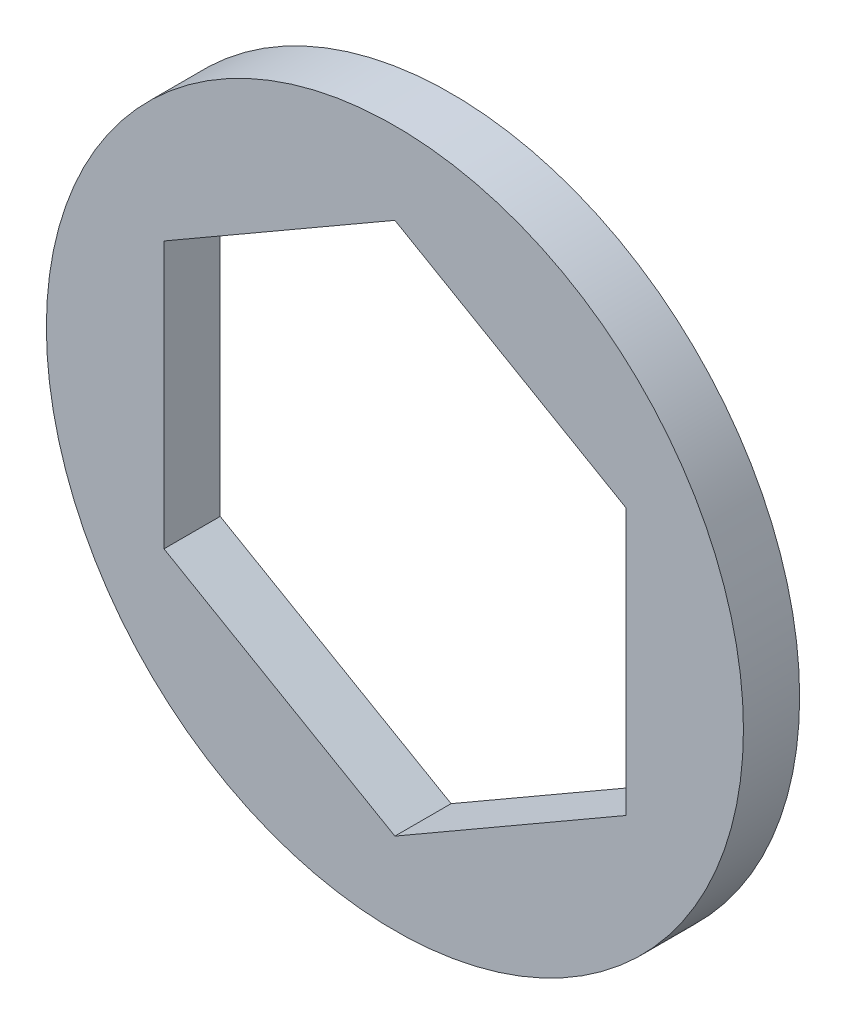
ISO-10303-21;
HEADER;
FILE_DESCRIPTION(('STEP AP214'),'2;1');
FILE_NAME('part.step','',(''),(''),'','','');
FILE_SCHEMA(('AUTOMOTIVE_DESIGN { 1 0 10303 214 1 1 1 1 }'));
ENDSEC;
DATA;
#1=APPLICATION_CONTEXT('core data for automotive mechanical design processes');
#2=APPLICATION_PROTOCOL_DEFINITION('international standard','automotive_design',2000,#1);
#3=PRODUCT_CONTEXT('',#1,'mechanical');
#4=PRODUCT('Part','Part','',(#3));
#5=PRODUCT_RELATED_PRODUCT_CATEGORY('part','',(#4));
#6=PRODUCT_DEFINITION_FORMATION('','',#4);
#7=PRODUCT_DEFINITION_CONTEXT('part definition',#1,'design');
#8=PRODUCT_DEFINITION('design','',#6,#7);
#9=PRODUCT_DEFINITION_SHAPE('','',#8);
#10=(LENGTH_UNIT() NAMED_UNIT(*) SI_UNIT(.MILLI.,.METRE.));
#11=(NAMED_UNIT(*) PLANE_ANGLE_UNIT() SI_UNIT($,.RADIAN.));
#12=(NAMED_UNIT(*) SI_UNIT($,.STERADIAN.) SOLID_ANGLE_UNIT());
#13=UNCERTAINTY_MEASURE_WITH_UNIT(LENGTH_MEASURE(1.E-05),#10,'distance_accuracy_value','');
#14=(GEOMETRIC_REPRESENTATION_CONTEXT(3) GLOBAL_UNCERTAINTY_ASSIGNED_CONTEXT((#13)) GLOBAL_UNIT_ASSIGNED_CONTEXT((#10,
#11,#12)) REPRESENTATION_CONTEXT('',''));
#15=CARTESIAN_POINT('',(0.,0.,0.));
#16=DIRECTION('',(0.,0.,1.));
#17=DIRECTION('',(1.,0.,0.));
#18=AXIS2_PLACEMENT_3D('',#15,#16,#17);
#19=CARTESIAN_POINT('',(0.,0.,0.81915));
#20=DIRECTION('',(0.,0.,1.));
#21=DIRECTION('',(1.,0.,0.));
#22=AXIS2_PLACEMENT_3D('',#19,#20,#21);
#23=PLANE('',#22);
#24=CARTESIAN_POINT('',(0.,0.,0.81915));
#25=DIRECTION('',(0.,0.,1.));
#26=DIRECTION('',(1.,0.,0.));
#27=AXIS2_PLACEMENT_3D('',#24,#25,#26);
#28=CIRCLE('',#27,10.16);
#29=CARTESIAN_POINT('',(-10.16,0.,0.81915));
#30=VERTEX_POINT('',#29);
#31=EDGE_CURVE('E11',#30,#30,#28,.T.);
#32=ORIENTED_EDGE('',*,*,#31,.T.);
#33=EDGE_LOOP('',(#32));
#34=FACE_BOUND('',#33,.T.);
#35=DIRECTION('',(-0.866025403784438,-0.5,0.));
#36=VECTOR('',#35,1.);
#37=CARTESIAN_POINT('',(0.,7.77228932383074,0.81915));
#38=LINE('',#37,#36);
#39=CARTESIAN_POINT('',(0.,7.77228932383074,0.81915));
#40=VERTEX_POINT('',#39);
#41=CARTESIAN_POINT('',(-6.731,3.88614466191537,0.81915));
#42=VERTEX_POINT('',#41);
#43=EDGE_CURVE('E98',#40,#42,#38,.T.);
#44=ORIENTED_EDGE('',*,*,#43,.F.);
#45=DIRECTION('',(-0.866025403784439,0.5,0.));
#46=VECTOR('',#45,1.);
#47=CARTESIAN_POINT('',(6.731,3.88614466191537,0.81915));
#48=LINE('',#47,#46);
#49=CARTESIAN_POINT('',(6.731,3.88614466191537,0.81915));
#50=VERTEX_POINT('',#49);
#51=EDGE_CURVE('E90',#50,#40,#48,.T.);
#52=ORIENTED_EDGE('',*,*,#51,.F.);
#53=DIRECTION('',(0.,1.,0.));
#54=VECTOR('',#53,1.);
#55=CARTESIAN_POINT('',(6.731,-3.88614466191537,0.81915));
#56=LINE('',#55,#54);
#57=CARTESIAN_POINT('',(6.731,-3.88614466191537,0.81915));
#58=VERTEX_POINT('',#57);
#59=EDGE_CURVE('E118',#58,#50,#56,.T.);
#60=ORIENTED_EDGE('',*,*,#59,.F.);
#61=DIRECTION('',(0.866025403784438,0.5,0.));
#62=VECTOR('',#61,1.);
#63=CARTESIAN_POINT('',(0.,-7.77228932383074,0.81915));
#64=LINE('',#63,#62);
#65=CARTESIAN_POINT('',(0.,-7.77228932383074,0.81915));
#66=VERTEX_POINT('',#65);
#67=EDGE_CURVE('E116',#66,#58,#64,.T.);
#68=ORIENTED_EDGE('',*,*,#67,.F.);
#69=DIRECTION('',(0.866025403784439,-0.5,0.));
#70=VECTOR('',#69,1.);
#71=CARTESIAN_POINT('',(-6.731,-3.88614466191537,0.81915));
#72=LINE('',#71,#70);
#73=CARTESIAN_POINT('',(-6.731,-3.88614466191537,0.81915));
#74=VERTEX_POINT('',#73);
#75=EDGE_CURVE('E112',#74,#66,#72,.T.);
#76=ORIENTED_EDGE('',*,*,#75,.F.);
#77=DIRECTION('',(0.,-1.,0.));
#78=VECTOR('',#77,1.);
#79=CARTESIAN_POINT('',(-6.731,3.88614466191537,0.81915));
#80=LINE('',#79,#78);
#81=EDGE_CURVE('E110',#42,#74,#80,.T.);
#82=ORIENTED_EDGE('',*,*,#81,.F.);
#83=EDGE_LOOP('',(#44,#52,#60,#68,#76,#82));
#84=FACE_BOUND('',#83,.T.);
#85=ADVANCED_FACE('F37',(#34,#84),#23,.T.);
#86=CARTESIAN_POINT('',(0.,0.,-0.81915));
#87=DIRECTION('',(0.,0.,1.));
#88=DIRECTION('',(1.,0.,0.));
#89=AXIS2_PLACEMENT_3D('',#86,#87,#88);
#90=PLANE('',#89);
#91=CARTESIAN_POINT('',(0.,0.,-0.81915));
#92=DIRECTION('',(0.,0.,1.));
#93=DIRECTION('',(1.,0.,0.));
#94=AXIS2_PLACEMENT_3D('',#91,#92,#93);
#95=CIRCLE('',#94,10.16);
#96=CARTESIAN_POINT('',(-10.16,0.,-0.81915));
#97=VERTEX_POINT('',#96);
#98=EDGE_CURVE('E41',#97,#97,#95,.T.);
#99=ORIENTED_EDGE('',*,*,#98,.F.);
#100=EDGE_LOOP('',(#99));
#101=FACE_BOUND('',#100,.T.);
#102=DIRECTION('',(-0.866025403784439,0.5,0.));
#103=VECTOR('',#102,1.);
#104=CARTESIAN_POINT('',(6.731,3.88614466191537,-0.81915));
#105=LINE('',#104,#103);
#106=CARTESIAN_POINT('',(6.731,3.88614466191537,-0.81915));
#107=VERTEX_POINT('',#106);
#108=CARTESIAN_POINT('',(0.,7.77228932383074,-0.81915));
#109=VERTEX_POINT('',#108);
#110=EDGE_CURVE('E60',#107,#109,#105,.T.);
#111=ORIENTED_EDGE('',*,*,#110,.T.);
#112=DIRECTION('',(-0.866025403784438,-0.5,0.));
#113=VECTOR('',#112,1.);
#114=CARTESIAN_POINT('',(0.,7.77228932383074,-0.81915));
#115=LINE('',#114,#113);
#116=CARTESIAN_POINT('',(-6.731,3.88614466191537,-0.81915));
#117=VERTEX_POINT('',#116);
#118=EDGE_CURVE('E105',#109,#117,#115,.T.);
#119=ORIENTED_EDGE('',*,*,#118,.T.);
#120=DIRECTION('',(0.,-1.,0.));
#121=VECTOR('',#120,1.);
#122=CARTESIAN_POINT('',(-6.731,3.88614466191537,-0.81915));
#123=LINE('',#122,#121);
#124=CARTESIAN_POINT('',(-6.731,-3.88614466191537,-0.81915));
#125=VERTEX_POINT('',#124);
#126=EDGE_CURVE('E122',#117,#125,#123,.T.);
#127=ORIENTED_EDGE('',*,*,#126,.T.);
#128=DIRECTION('',(0.866025403784439,-0.5,0.));
#129=VECTOR('',#128,1.);
#130=CARTESIAN_POINT('',(-6.731,-3.88614466191537,-0.81915));
#131=LINE('',#130,#129);
#132=CARTESIAN_POINT('',(0.,-7.77228932383074,-0.81915));
#133=VERTEX_POINT('',#132);
#134=EDGE_CURVE('E125',#125,#133,#131,.T.);
#135=ORIENTED_EDGE('',*,*,#134,.T.);
#136=DIRECTION('',(0.866025403784438,0.5,0.));
#137=VECTOR('',#136,1.);
#138=CARTESIAN_POINT('',(0.,-7.77228932383074,-0.81915));
#139=LINE('',#138,#137);
#140=CARTESIAN_POINT('',(6.731,-3.88614466191537,-0.81915));
#141=VERTEX_POINT('',#140);
#142=EDGE_CURVE('E128',#133,#141,#139,.T.);
#143=ORIENTED_EDGE('',*,*,#142,.T.);
#144=DIRECTION('',(0.,1.,0.));
#145=VECTOR('',#144,1.);
#146=CARTESIAN_POINT('',(6.731,-3.88614466191537,-0.81915));
#147=LINE('',#146,#145);
#148=EDGE_CURVE('E99',#141,#107,#147,.T.);
#149=ORIENTED_EDGE('',*,*,#148,.T.);
#150=EDGE_LOOP('',(#111,#119,#127,#135,#143,#149));
#151=FACE_BOUND('',#150,.T.);
#152=ADVANCED_FACE('F145',(#101,#151),#90,.F.);
#153=CARTESIAN_POINT('',(0.,0.,0.81915));
#154=DIRECTION('',(0.,0.,-1.));
#155=DIRECTION('',(-1.,0.,0.));
#156=AXIS2_PLACEMENT_3D('',#153,#154,#155);
#157=CYLINDRICAL_SURFACE('',#156,10.16);
#158=CARTESIAN_POINT('',(-10.16,0.,0.81915));
#159=CARTESIAN_POINT('',(-10.16,0.,0.802084375));
#160=CARTESIAN_POINT('',(-10.16,0.,0.78501875));
#161=CARTESIAN_POINT('',(-10.16,0.,0.7508875));
#162=CARTESIAN_POINT('',(-10.16,0.,0.733821875));
#163=CARTESIAN_POINT('',(-10.16,0.,0.699690625));
#164=CARTESIAN_POINT('',(-10.16,0.,0.682625));
#165=CARTESIAN_POINT('',(-10.16,0.,0.64849375));
#166=CARTESIAN_POINT('',(-10.16,0.,0.631428125));
#167=CARTESIAN_POINT('',(-10.16,0.,0.597296875));
#168=CARTESIAN_POINT('',(-10.16,0.,0.58023125));
#169=CARTESIAN_POINT('',(-10.16,0.,0.5461));
#170=CARTESIAN_POINT('',(-10.16,0.,0.529034375));
#171=CARTESIAN_POINT('',(-10.16,0.,0.494903125));
#172=CARTESIAN_POINT('',(-10.16,0.,0.4778375));
#173=CARTESIAN_POINT('',(-10.16,0.,0.44370625));
#174=CARTESIAN_POINT('',(-10.16,0.,0.426640625));
#175=CARTESIAN_POINT('',(-10.16,0.,0.392509375));
#176=CARTESIAN_POINT('',(-10.16,0.,0.37544375));
#177=CARTESIAN_POINT('',(-10.16,0.,0.3413125));
#178=CARTESIAN_POINT('',(-10.16,0.,0.324246875));
#179=CARTESIAN_POINT('',(-10.16,0.,0.290115625));
#180=CARTESIAN_POINT('',(-10.16,0.,0.27305));
#181=CARTESIAN_POINT('',(-10.16,0.,0.23891875));
#182=CARTESIAN_POINT('',(-10.16,0.,0.221853125));
#183=CARTESIAN_POINT('',(-10.16,0.,0.187721875));
#184=CARTESIAN_POINT('',(-10.16,0.,0.17065625));
#185=CARTESIAN_POINT('',(-10.16,0.,0.136525));
#186=CARTESIAN_POINT('',(-10.16,0.,0.119459375));
#187=CARTESIAN_POINT('',(-10.16,0.,0.0853281249999998));
#188=CARTESIAN_POINT('',(-10.16,0.,0.0682624999999998));
#189=CARTESIAN_POINT('',(-10.16,0.,0.0341312499999998));
#190=CARTESIAN_POINT('',(-10.16,0.,0.0170656249999998));
#191=CARTESIAN_POINT('',(-10.16,0.,-0.0170656250000002));
#192=CARTESIAN_POINT('',(-10.16,0.,-0.0341312500000003));
#193=CARTESIAN_POINT('',(-10.16,0.,-0.0682625000000003));
#194=CARTESIAN_POINT('',(-10.16,0.,-0.0853281250000003));
#195=CARTESIAN_POINT('',(-10.16,0.,-0.119459375));
#196=CARTESIAN_POINT('',(-10.16,0.,-0.136525));
#197=CARTESIAN_POINT('',(-10.16,0.,-0.17065625));
#198=CARTESIAN_POINT('',(-10.16,0.,-0.187721875));
#199=CARTESIAN_POINT('',(-10.16,0.,-0.221853125));
#200=CARTESIAN_POINT('',(-10.16,0.,-0.23891875));
#201=CARTESIAN_POINT('',(-10.16,0.,-0.27305));
#202=CARTESIAN_POINT('',(-10.16,0.,-0.290115625));
#203=CARTESIAN_POINT('',(-10.16,0.,-0.324246875));
#204=CARTESIAN_POINT('',(-10.16,0.,-0.3413125));
#205=CARTESIAN_POINT('',(-10.16,0.,-0.37544375));
#206=CARTESIAN_POINT('',(-10.16,0.,-0.392509375));
#207=CARTESIAN_POINT('',(-10.16,0.,-0.426640625));
#208=CARTESIAN_POINT('',(-10.16,0.,-0.44370625));
#209=CARTESIAN_POINT('',(-10.16,0.,-0.4778375));
#210=CARTESIAN_POINT('',(-10.16,0.,-0.494903125));
#211=CARTESIAN_POINT('',(-10.16,0.,-0.529034375));
#212=CARTESIAN_POINT('',(-10.16,0.,-0.5461));
#213=CARTESIAN_POINT('',(-10.16,0.,-0.58023125));
#214=CARTESIAN_POINT('',(-10.16,0.,-0.597296875));
#215=CARTESIAN_POINT('',(-10.16,0.,-0.631428125));
#216=CARTESIAN_POINT('',(-10.16,0.,-0.64849375));
#217=CARTESIAN_POINT('',(-10.16,0.,-0.682625));
#218=CARTESIAN_POINT('',(-10.16,0.,-0.699690625));
#219=CARTESIAN_POINT('',(-10.16,0.,-0.733821875));
#220=CARTESIAN_POINT('',(-10.16,0.,-0.7508875));
#221=CARTESIAN_POINT('',(-10.16,0.,-0.78501875));
#222=CARTESIAN_POINT('',(-10.16,0.,-0.802084375));
#223=CARTESIAN_POINT('',(-10.16,0.,-0.81915));
#224=B_SPLINE_CURVE_WITH_KNOTS('',3,(#158,#159,#160,#161,#162,#163,#164,#165,#166,#167,#168,
#169,#170,#171,#172,#173,#174,#175,#176,#177,#178,#179,#180,#181,#182,#183,#184,#185,#186,#187,
#188,#189,#190,#191,#192,#193,#194,#195,#196,#197,#198,#199,#200,#201,#202,#203,#204,#205,#206,
#207,#208,#209,#210,#211,#212,#213,#214,#215,#216,#217,#218,#219,#220,#221,#222,#223),
.UNSPECIFIED.,.F.,.F.,(4,2,2,2,2,2,2,2,2,2,2,2,2,2,2,2,2,2,2,2,2,2,2,2,2,2,2,2,2,2,2,2,4),(0.,
0.051196875,0.10239375,0.153590625,0.2047875,0.255984375,0.30718125,0.358378125,0.409575,
0.460771875,0.51196875,0.563165625,0.6143625,0.665559375,0.71675625,0.767953125,0.81915,
0.870346875,0.92154375,0.972740625,1.0239375,1.075134375,1.12633125,1.177528125,1.228725,
1.279921875,1.33111875,1.382315625,1.4335125,1.484709375,1.53590625,1.587103125,1.6383),.UNSPECIFIED.);
#225=EDGE_CURVE('BSEAM39',#30,#97,#224,.T.);
#226=ORIENTED_EDGE('',*,*,#31,.F.);
#227=ORIENTED_EDGE('',*,*,#98,.T.);
#228=ORIENTED_EDGE('',*,*,#225,.T.);
#229=ORIENTED_EDGE('',*,*,#225,.F.);
#230=EDGE_LOOP('',(#226,#228,#227,#229));
#231=FACE_BOUND('',#230,.T.);
#232=ADVANCED_FACE('F39',(#231),#157,.T.);
#233=CARTESIAN_POINT('',(6.731,3.88614466191537,0.81915));
#234=DIRECTION('',(-0.5,-0.866025403784439,0.));
#235=DIRECTION('',(0.866025403784439,-0.5,0.));
#236=AXIS2_PLACEMENT_3D('',#233,#234,#235);
#237=PLANE('',#236);
#238=ORIENTED_EDGE('',*,*,#110,.F.);
#239=DIRECTION('',(0.,0.,-1.));
#240=VECTOR('',#239,1.);
#241=CARTESIAN_POINT('',(6.731,3.88614466191537,0.81915));
#242=LINE('',#241,#240);
#243=EDGE_CURVE('E94',#50,#107,#242,.T.);
#244=ORIENTED_EDGE('',*,*,#243,.F.);
#245=ORIENTED_EDGE('',*,*,#51,.T.);
#246=DIRECTION('',(0.,0.,-1.));
#247=VECTOR('',#246,1.);
#248=CARTESIAN_POINT('',(0.,7.77228932383074,0.81915));
#249=LINE('',#248,#247);
#250=EDGE_CURVE('E93',#40,#109,#249,.T.);
#251=ORIENTED_EDGE('',*,*,#250,.T.);
#252=EDGE_LOOP('',(#238,#244,#245,#251));
#253=FACE_BOUND('',#252,.T.);
#254=ADVANCED_FACE('F92',(#253),#237,.T.);
#255=CARTESIAN_POINT('',(0.,7.77228932383074,0.81915));
#256=DIRECTION('',(0.5,-0.866025403784438,0.));
#257=DIRECTION('',(0.866025403784438,0.5,0.));
#258=AXIS2_PLACEMENT_3D('',#255,#256,#257);
#259=PLANE('',#258);
#260=ORIENTED_EDGE('',*,*,#118,.F.);
#261=ORIENTED_EDGE('',*,*,#250,.F.);
#262=ORIENTED_EDGE('',*,*,#43,.T.);
#263=DIRECTION('',(0.,0.,-1.));
#264=VECTOR('',#263,1.);
#265=CARTESIAN_POINT('',(-6.731,3.88614466191537,0.81915));
#266=LINE('',#265,#264);
#267=EDGE_CURVE('E106',#42,#117,#266,.T.);
#268=ORIENTED_EDGE('',*,*,#267,.T.);
#269=EDGE_LOOP('',(#260,#261,#262,#268));
#270=FACE_BOUND('',#269,.T.);
#271=ADVANCED_FACE('F102',(#270),#259,.T.);
#272=CARTESIAN_POINT('',(-6.731,3.88614466191537,0.81915));
#273=DIRECTION('',(1.,0.,0.));
#274=DIRECTION('',(0.,1.,0.));
#275=AXIS2_PLACEMENT_3D('',#272,#273,#274);
#276=PLANE('',#275);
#277=ORIENTED_EDGE('',*,*,#126,.F.);
#278=ORIENTED_EDGE('',*,*,#267,.F.);
#279=ORIENTED_EDGE('',*,*,#81,.T.);
#280=DIRECTION('',(0.,0.,-1.));
#281=VECTOR('',#280,1.);
#282=CARTESIAN_POINT('',(-6.731,-3.88614466191537,0.81915));
#283=LINE('',#282,#281);
#284=EDGE_CURVE('E137',#74,#125,#283,.T.);
#285=ORIENTED_EDGE('',*,*,#284,.T.);
#286=EDGE_LOOP('',(#277,#278,#279,#285));
#287=FACE_BOUND('',#286,.T.);
#288=ADVANCED_FACE('F141',(#287),#276,.T.);
#289=CARTESIAN_POINT('',(-6.731,-3.88614466191537,0.81915));
#290=DIRECTION('',(0.5,0.866025403784439,0.));
#291=DIRECTION('',(-0.866025403784439,0.5,0.));
#292=AXIS2_PLACEMENT_3D('',#289,#290,#291);
#293=PLANE('',#292);
#294=ORIENTED_EDGE('',*,*,#134,.F.);
#295=ORIENTED_EDGE('',*,*,#284,.F.);
#296=ORIENTED_EDGE('',*,*,#75,.T.);
#297=DIRECTION('',(0.,0.,-1.));
#298=VECTOR('',#297,1.);
#299=CARTESIAN_POINT('',(0.,-7.77228932383074,0.81915));
#300=LINE('',#299,#298);
#301=EDGE_CURVE('E135',#66,#133,#300,.T.);
#302=ORIENTED_EDGE('',*,*,#301,.T.);
#303=EDGE_LOOP('',(#294,#295,#296,#302));
#304=FACE_BOUND('',#303,.T.);
#305=ADVANCED_FACE('F153',(#304),#293,.T.);
#306=CARTESIAN_POINT('',(0.,-7.77228932383074,0.81915));
#307=DIRECTION('',(-0.5,0.866025403784438,0.));
#308=DIRECTION('',(-0.866025403784439,-0.5,0.));
#309=AXIS2_PLACEMENT_3D('',#306,#307,#308);
#310=PLANE('',#309);
#311=ORIENTED_EDGE('',*,*,#142,.F.);
#312=ORIENTED_EDGE('',*,*,#301,.F.);
#313=ORIENTED_EDGE('',*,*,#67,.T.);
#314=DIRECTION('',(0.,0.,-1.));
#315=VECTOR('',#314,1.);
#316=CARTESIAN_POINT('',(6.731,-3.88614466191537,0.81915));
#317=LINE('',#316,#315);
#318=EDGE_CURVE('E52',#58,#141,#317,.T.);
#319=ORIENTED_EDGE('',*,*,#318,.T.);
#320=EDGE_LOOP('',(#311,#312,#313,#319));
#321=FACE_BOUND('',#320,.T.);
#322=ADVANCED_FACE('F151',(#321),#310,.T.);
#323=CARTESIAN_POINT('',(6.731,-3.88614466191537,0.81915));
#324=DIRECTION('',(-1.,0.,0.));
#325=DIRECTION('',(0.,0.,1.));
#326=AXIS2_PLACEMENT_3D('',#323,#324,#325);
#327=PLANE('',#326);
#328=ORIENTED_EDGE('',*,*,#148,.F.);
#329=ORIENTED_EDGE('',*,*,#318,.F.);
#330=ORIENTED_EDGE('',*,*,#59,.T.);
#331=ORIENTED_EDGE('',*,*,#243,.T.);
#332=EDGE_LOOP('',(#328,#329,#330,#331));
#333=FACE_BOUND('',#332,.T.);
#334=ADVANCED_FACE('F147',(#333),#327,.T.);
#335=CLOSED_SHELL('',(#85,#152,#232,#254,#271,#288,#305,#322,#334));
#336=MANIFOLD_SOLID_BREP('B2',#335);
#337=ADVANCED_BREP_SHAPE_REPRESENTATION('',(#18,#336),#14);
#338=SHAPE_DEFINITION_REPRESENTATION(#9,#337);
ENDSEC;
END-ISO-10303-21;
